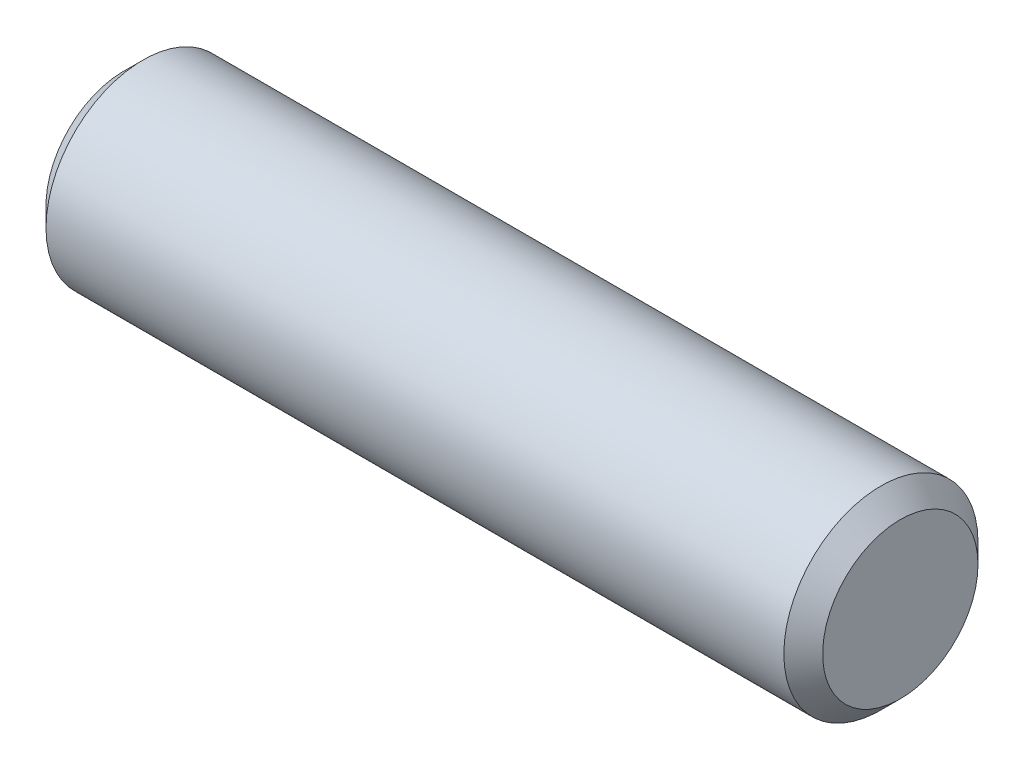
ISO-10303-21;
HEADER;
FILE_DESCRIPTION(('STEP AP214'),'2;1');
FILE_NAME('part.step','',(''),(''),'','','');
FILE_SCHEMA(('AUTOMOTIVE_DESIGN { 1 0 10303 214 1 1 1 1 }'));
ENDSEC;
DATA;
#1=APPLICATION_CONTEXT('core data for automotive mechanical design processes');
#2=APPLICATION_PROTOCOL_DEFINITION('international standard','automotive_design',2000,#1);
#3=PRODUCT_CONTEXT('',#1,'mechanical');
#4=PRODUCT('Part','Part','',(#3));
#5=PRODUCT_RELATED_PRODUCT_CATEGORY('part','',(#4));
#6=PRODUCT_DEFINITION_FORMATION('','',#4);
#7=PRODUCT_DEFINITION_CONTEXT('part definition',#1,'design');
#8=PRODUCT_DEFINITION('design','',#6,#7);
#9=PRODUCT_DEFINITION_SHAPE('','',#8);
#10=(LENGTH_UNIT() NAMED_UNIT(*) SI_UNIT(.MILLI.,.METRE.));
#11=(NAMED_UNIT(*) PLANE_ANGLE_UNIT() SI_UNIT($,.RADIAN.));
#12=(NAMED_UNIT(*) SI_UNIT($,.STERADIAN.) SOLID_ANGLE_UNIT());
#13=UNCERTAINTY_MEASURE_WITH_UNIT(LENGTH_MEASURE(1.E-05),#10,'distance_accuracy_value','');
#14=(GEOMETRIC_REPRESENTATION_CONTEXT(3) GLOBAL_UNCERTAINTY_ASSIGNED_CONTEXT((#13)) GLOBAL_UNIT_ASSIGNED_CONTEXT((#10,
#11,#12)) REPRESENTATION_CONTEXT('',''));
#15=CARTESIAN_POINT('',(0.,0.,0.));
#16=DIRECTION('',(0.,0.,1.));
#17=DIRECTION('',(1.,0.,0.));
#18=AXIS2_PLACEMENT_3D('',#15,#16,#17);
#19=CARTESIAN_POINT('',(-12.7,0.,0.));
#20=DIRECTION('',(1.,0.,0.));
#21=DIRECTION('',(0.,0.,-1.));
#22=AXIS2_PLACEMENT_3D('',#19,#20,#21);
#23=CYLINDRICAL_SURFACE('',#22,3.175);
#24=CARTESIAN_POINT('',(12.065,0.,0.));
#25=DIRECTION('',(1.,0.,0.));
#26=DIRECTION('',(0.,0.,-1.));
#27=AXIS2_PLACEMENT_3D('',#24,#25,#26);
#28=CIRCLE('',#27,3.175);
#29=CARTESIAN_POINT('',(12.065,0.,-3.175));
#30=VERTEX_POINT('',#29);
#31=EDGE_CURVE('E40',#30,#30,#28,.F.);
#32=ORIENTED_EDGE('',*,*,#31,.T.);
#33=EDGE_LOOP('',(#32));
#34=FACE_BOUND('',#33,.T.);
#35=CARTESIAN_POINT('',(-12.065,0.,0.));
#36=DIRECTION('',(1.,0.,0.));
#37=DIRECTION('',(0.,0.,-1.));
#38=AXIS2_PLACEMENT_3D('',#35,#36,#37);
#39=CIRCLE('',#38,3.175);
#40=CARTESIAN_POINT('',(-12.065,0.,-3.175));
#41=VERTEX_POINT('',#40);
#42=EDGE_CURVE('E44',#41,#41,#39,.T.);
#43=ORIENTED_EDGE('',*,*,#42,.T.);
#44=EDGE_LOOP('',(#43));
#45=FACE_BOUND('',#44,.T.);
#46=ADVANCED_FACE('F33',(#34,#45),#23,.T.);
#47=CARTESIAN_POINT('',(-12.7,0.,0.));
#48=DIRECTION('',(1.,0.,0.));
#49=DIRECTION('',(0.,0.,-1.));
#50=AXIS2_PLACEMENT_3D('',#47,#48,#49);
#51=PLANE('',#50);
#52=CARTESIAN_POINT('',(-12.7,0.,0.));
#53=DIRECTION('',(1.,0.,0.));
#54=DIRECTION('',(0.,0.,-1.));
#55=AXIS2_PLACEMENT_3D('',#52,#53,#54);
#56=CIRCLE('',#55,2.54);
#57=CARTESIAN_POINT('',(-12.7,0.,-2.54));
#58=VERTEX_POINT('',#57);
#59=EDGE_CURVE('E10',#58,#58,#56,.F.);
#60=ORIENTED_EDGE('',*,*,#59,.T.);
#61=EDGE_LOOP('',(#60));
#62=FACE_BOUND('',#61,.T.);
#63=ADVANCED_FACE('F64',(#62),#51,.F.);
#64=CARTESIAN_POINT('',(12.7,0.,0.));
#65=DIRECTION('',(1.,0.,0.));
#66=DIRECTION('',(0.,0.,-1.));
#67=AXIS2_PLACEMENT_3D('',#64,#65,#66);
#68=PLANE('',#67);
#69=CARTESIAN_POINT('',(12.7,0.,0.));
#70=DIRECTION('',(1.,0.,0.));
#71=DIRECTION('',(0.,0.,-1.));
#72=AXIS2_PLACEMENT_3D('',#69,#70,#71);
#73=CIRCLE('',#72,2.54);
#74=CARTESIAN_POINT('',(12.7,0.,-2.54));
#75=VERTEX_POINT('',#74);
#76=EDGE_CURVE('E48',#75,#75,#73,.T.);
#77=ORIENTED_EDGE('',*,*,#76,.T.);
#78=EDGE_LOOP('',(#77));
#79=FACE_BOUND('',#78,.T.);
#80=ADVANCED_FACE('F54',(#79),#68,.T.);
#81=CARTESIAN_POINT('',(12.7,0.,0.));
#82=DIRECTION('',(-1.,0.,0.));
#83=DIRECTION('',(0.,0.,1.));
#84=AXIS2_PLACEMENT_3D('',#81,#82,#83);
#85=CONICAL_SURFACE('',#84,2.54,0.785398163397445);
#86=ORIENTED_EDGE('',*,*,#31,.F.);
#87=EDGE_LOOP('',(#86));
#88=FACE_BOUND('',#87,.T.);
#89=ORIENTED_EDGE('',*,*,#76,.F.);
#90=EDGE_LOOP('',(#89));
#91=FACE_BOUND('',#90,.T.);
#92=ADVANCED_FACE('F56',(#88,#91),#85,.T.);
#93=CARTESIAN_POINT('',(-12.065,0.,0.));
#94=DIRECTION('',(1.,0.,0.));
#95=DIRECTION('',(0.,0.,-1.));
#96=AXIS2_PLACEMENT_3D('',#93,#94,#95);
#97=CONICAL_SURFACE('',#96,3.175,0.785398163397448);
#98=ORIENTED_EDGE('',*,*,#59,.F.);
#99=EDGE_LOOP('',(#98));
#100=FACE_BOUND('',#99,.T.);
#101=ORIENTED_EDGE('',*,*,#42,.F.);
#102=EDGE_LOOP('',(#101));
#103=FACE_BOUND('',#102,.T.);
#104=ADVANCED_FACE('F35',(#100,#103),#97,.T.);
#105=CLOSED_SHELL('',(#46,#63,#80,#92,#104));
#106=MANIFOLD_SOLID_BREP('B2',#105);
#107=ADVANCED_BREP_SHAPE_REPRESENTATION('',(#18,#106),#14);
#108=SHAPE_DEFINITION_REPRESENTATION(#9,#107);
ENDSEC;
END-ISO-10303-21;
